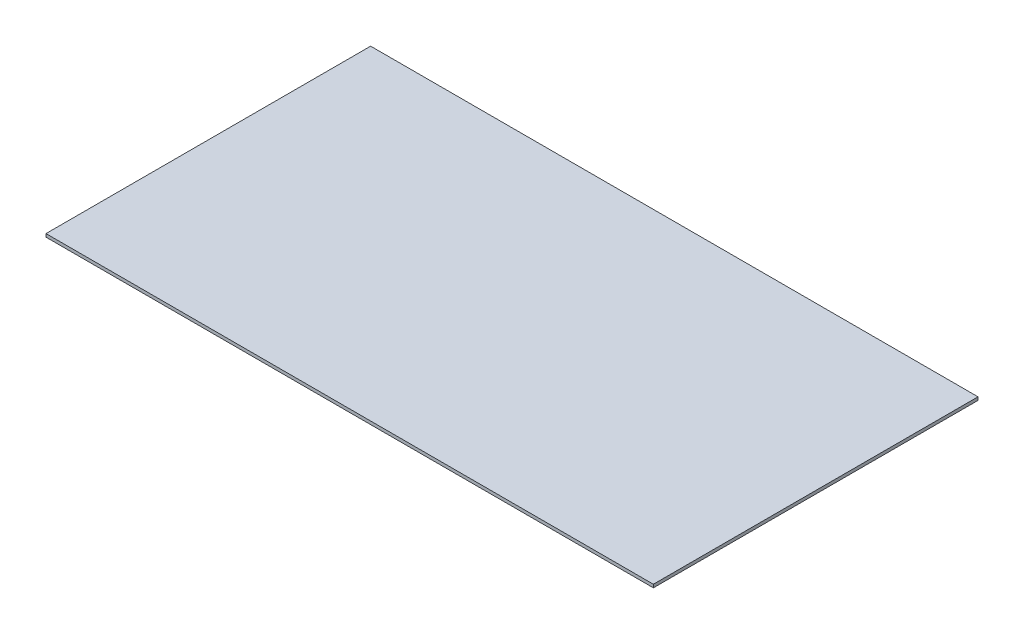
ISO-10303-21;
HEADER;
FILE_DESCRIPTION(('STEP AP214'),'2;1');
FILE_NAME('part.step','',(''),(''),'','','');
FILE_SCHEMA(('AUTOMOTIVE_DESIGN { 1 0 10303 214 1 1 1 1 }'));
ENDSEC;
DATA;
#1=APPLICATION_CONTEXT('core data for automotive mechanical design processes');
#2=APPLICATION_PROTOCOL_DEFINITION('international standard','automotive_design',2000,#1);
#3=PRODUCT_CONTEXT('',#1,'mechanical');
#4=PRODUCT('Part','Part','',(#3));
#5=PRODUCT_RELATED_PRODUCT_CATEGORY('part','',(#4));
#6=PRODUCT_DEFINITION_FORMATION('','',#4);
#7=PRODUCT_DEFINITION_CONTEXT('part definition',#1,'design');
#8=PRODUCT_DEFINITION('design','',#6,#7);
#9=PRODUCT_DEFINITION_SHAPE('','',#8);
#10=(LENGTH_UNIT() NAMED_UNIT(*) SI_UNIT(.MILLI.,.METRE.));
#11=(NAMED_UNIT(*) PLANE_ANGLE_UNIT() SI_UNIT($,.RADIAN.));
#12=(NAMED_UNIT(*) SI_UNIT($,.STERADIAN.) SOLID_ANGLE_UNIT());
#13=UNCERTAINTY_MEASURE_WITH_UNIT(LENGTH_MEASURE(1.E-05),#10,'distance_accuracy_value','');
#14=(GEOMETRIC_REPRESENTATION_CONTEXT(3) GLOBAL_UNCERTAINTY_ASSIGNED_CONTEXT((#13)) GLOBAL_UNIT_ASSIGNED_CONTEXT((#10,
#11,#12)) REPRESENTATION_CONTEXT('',''));
#15=CARTESIAN_POINT('',(0.,0.,0.));
#16=DIRECTION('',(0.,0.,1.));
#17=DIRECTION('',(1.,0.,0.));
#18=AXIS2_PLACEMENT_3D('',#15,#16,#17);
#19=CARTESIAN_POINT('',(290.,3.,-155.));
#20=DIRECTION('',(-1.,0.,0.));
#21=DIRECTION('',(0.,0.,1.));
#22=AXIS2_PLACEMENT_3D('',#19,#20,#21);
#23=PLANE('',#22);
#24=DIRECTION('',(0.,0.,-1.));
#25=VECTOR('',#24,1.);
#26=CARTESIAN_POINT('',(290.,0.,-155.));
#27=LINE('',#26,#25);
#28=CARTESIAN_POINT('',(290.,0.,155.));
#29=VERTEX_POINT('',#28);
#30=CARTESIAN_POINT('',(290.,0.,-155.));
#31=VERTEX_POINT('',#30);
#32=EDGE_CURVE('E98',#29,#31,#27,.T.);
#33=ORIENTED_EDGE('',*,*,#32,.T.);
#34=DIRECTION('',(0.,-1.,0.));
#35=VECTOR('',#34,1.);
#36=CARTESIAN_POINT('',(290.,3.,-155.));
#37=LINE('',#36,#35);
#38=CARTESIAN_POINT('',(290.,3.,-155.));
#39=VERTEX_POINT('',#38);
#40=EDGE_CURVE('E11',#39,#31,#37,.T.);
#41=ORIENTED_EDGE('',*,*,#40,.F.);
#42=DIRECTION('',(0.,0.,-1.));
#43=VECTOR('',#42,1.);
#44=CARTESIAN_POINT('',(290.,3.,-155.));
#45=LINE('',#44,#43);
#46=CARTESIAN_POINT('',(290.,3.,155.));
#47=VERTEX_POINT('',#46);
#48=EDGE_CURVE('E86',#47,#39,#45,.T.);
#49=ORIENTED_EDGE('',*,*,#48,.F.);
#50=DIRECTION('',(0.,-1.,0.));
#51=VECTOR('',#50,1.);
#52=CARTESIAN_POINT('',(290.,3.,155.));
#53=LINE('',#52,#51);
#54=EDGE_CURVE('E94',#47,#29,#53,.T.);
#55=ORIENTED_EDGE('',*,*,#54,.T.);
#56=EDGE_LOOP('',(#33,#41,#49,#55));
#57=FACE_BOUND('',#56,.T.);
#58=ADVANCED_FACE('F35',(#57),#23,.F.);
#59=CARTESIAN_POINT('',(-290.,3.,-155.));
#60=DIRECTION('',(0.,0.,1.));
#61=DIRECTION('',(1.,0.,0.));
#62=AXIS2_PLACEMENT_3D('',#59,#60,#61);
#63=PLANE('',#62);
#64=DIRECTION('',(-1.,0.,0.));
#65=VECTOR('',#64,1.);
#66=CARTESIAN_POINT('',(-290.,0.,-155.));
#67=LINE('',#66,#65);
#68=CARTESIAN_POINT('',(-290.,0.,-155.));
#69=VERTEX_POINT('',#68);
#70=EDGE_CURVE('E90',#31,#69,#67,.T.);
#71=ORIENTED_EDGE('',*,*,#70,.T.);
#72=DIRECTION('',(0.,-1.,0.));
#73=VECTOR('',#72,1.);
#74=CARTESIAN_POINT('',(-290.,3.,-155.));
#75=LINE('',#74,#73);
#76=CARTESIAN_POINT('',(-290.,3.,-155.));
#77=VERTEX_POINT('',#76);
#78=EDGE_CURVE('E43',#77,#69,#75,.T.);
#79=ORIENTED_EDGE('',*,*,#78,.F.);
#80=DIRECTION('',(-1.,0.,0.));
#81=VECTOR('',#80,1.);
#82=CARTESIAN_POINT('',(-290.,3.,-155.));
#83=LINE('',#82,#81);
#84=EDGE_CURVE('E81',#39,#77,#83,.T.);
#85=ORIENTED_EDGE('',*,*,#84,.F.);
#86=ORIENTED_EDGE('',*,*,#40,.T.);
#87=EDGE_LOOP('',(#71,#79,#85,#86));
#88=FACE_BOUND('',#87,.T.);
#89=ADVANCED_FACE('F89',(#88),#63,.F.);
#90=CARTESIAN_POINT('',(-290.,3.,-155.));
#91=DIRECTION('',(1.,0.,0.));
#92=DIRECTION('',(0.,0.,-1.));
#93=AXIS2_PLACEMENT_3D('',#90,#91,#92);
#94=PLANE('',#93);
#95=DIRECTION('',(0.,0.,1.));
#96=VECTOR('',#95,1.);
#97=CARTESIAN_POINT('',(-290.,0.,-155.));
#98=LINE('',#97,#96);
#99=CARTESIAN_POINT('',(-290.,0.,155.));
#100=VERTEX_POINT('',#99);
#101=EDGE_CURVE('E68',#69,#100,#98,.T.);
#102=ORIENTED_EDGE('',*,*,#101,.T.);
#103=DIRECTION('',(0.,-1.,0.));
#104=VECTOR('',#103,1.);
#105=CARTESIAN_POINT('',(-290.,3.,155.));
#106=LINE('',#105,#104);
#107=CARTESIAN_POINT('',(-290.,3.,155.));
#108=VERTEX_POINT('',#107);
#109=EDGE_CURVE('E91',#108,#100,#106,.T.);
#110=ORIENTED_EDGE('',*,*,#109,.F.);
#111=DIRECTION('',(0.,0.,1.));
#112=VECTOR('',#111,1.);
#113=CARTESIAN_POINT('',(-290.,3.,-155.));
#114=LINE('',#113,#112);
#115=EDGE_CURVE('E84',#77,#108,#114,.T.);
#116=ORIENTED_EDGE('',*,*,#115,.F.);
#117=ORIENTED_EDGE('',*,*,#78,.T.);
#118=EDGE_LOOP('',(#102,#110,#116,#117));
#119=FACE_BOUND('',#118,.T.);
#120=ADVANCED_FACE('F92',(#119),#94,.F.);
#121=CARTESIAN_POINT('',(-290.,3.,155.));
#122=DIRECTION('',(0.,0.,-1.));
#123=DIRECTION('',(-1.,0.,0.));
#124=AXIS2_PLACEMENT_3D('',#121,#122,#123);
#125=PLANE('',#124);
#126=DIRECTION('',(1.,0.,0.));
#127=VECTOR('',#126,1.);
#128=CARTESIAN_POINT('',(-290.,0.,155.));
#129=LINE('',#128,#127);
#130=EDGE_CURVE('E74',#100,#29,#129,.T.);
#131=ORIENTED_EDGE('',*,*,#130,.T.);
#132=ORIENTED_EDGE('',*,*,#54,.F.);
#133=DIRECTION('',(1.,0.,0.));
#134=VECTOR('',#133,1.);
#135=CARTESIAN_POINT('',(-290.,3.,155.));
#136=LINE('',#135,#134);
#137=EDGE_CURVE('E51',#108,#47,#136,.T.);
#138=ORIENTED_EDGE('',*,*,#137,.F.);
#139=ORIENTED_EDGE('',*,*,#109,.T.);
#140=EDGE_LOOP('',(#131,#132,#138,#139));
#141=FACE_BOUND('',#140,.T.);
#142=ADVANCED_FACE('F105',(#141),#125,.F.);
#143=CARTESIAN_POINT('',(0.,3.,0.));
#144=DIRECTION('',(0.,1.,0.));
#145=DIRECTION('',(0.,0.,1.));
#146=AXIS2_PLACEMENT_3D('',#143,#144,#145);
#147=PLANE('',#146);
#148=ORIENTED_EDGE('',*,*,#48,.T.);
#149=ORIENTED_EDGE('',*,*,#84,.T.);
#150=ORIENTED_EDGE('',*,*,#115,.T.);
#151=ORIENTED_EDGE('',*,*,#137,.T.);
#152=EDGE_LOOP('',(#148,#149,#150,#151));
#153=FACE_BOUND('',#152,.T.);
#154=ADVANCED_FACE('F82',(#153),#147,.T.);
#155=CARTESIAN_POINT('',(0.,0.,0.));
#156=DIRECTION('',(0.,1.,0.));
#157=DIRECTION('',(0.,0.,1.));
#158=AXIS2_PLACEMENT_3D('',#155,#156,#157);
#159=PLANE('',#158);
#160=ORIENTED_EDGE('',*,*,#32,.F.);
#161=ORIENTED_EDGE('',*,*,#130,.F.);
#162=ORIENTED_EDGE('',*,*,#101,.F.);
#163=ORIENTED_EDGE('',*,*,#70,.F.);
#164=EDGE_LOOP('',(#160,#161,#162,#163));
#165=FACE_BOUND('',#164,.T.);
#166=ADVANCED_FACE('F108',(#165),#159,.F.);
#167=CLOSED_SHELL('',(#58,#89,#120,#142,#154,#166));
#168=MANIFOLD_SOLID_BREP('B2',#167);
#169=ADVANCED_BREP_SHAPE_REPRESENTATION('',(#18,#168),#14);
#170=SHAPE_DEFINITION_REPRESENTATION(#9,#169);
ENDSEC;
END-ISO-10303-21;
